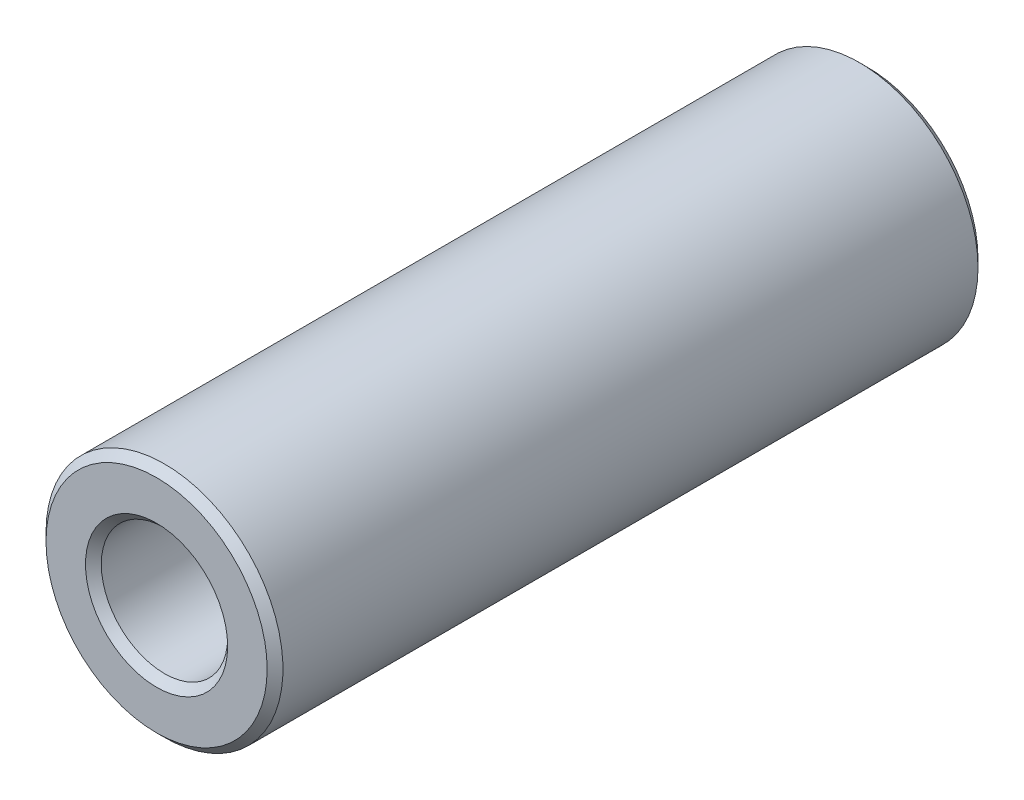
ISO-10303-21;
HEADER;
FILE_DESCRIPTION(('STEP AP214'),'2;1');
FILE_NAME('part.step','',(''),(''),'','','');
FILE_SCHEMA(('AUTOMOTIVE_DESIGN { 1 0 10303 214 1 1 1 1 }'));
ENDSEC;
DATA;
#1=APPLICATION_CONTEXT('core data for automotive mechanical design processes');
#2=APPLICATION_PROTOCOL_DEFINITION('international standard','automotive_design',2000,#1);
#3=PRODUCT_CONTEXT('',#1,'mechanical');
#4=PRODUCT('Part','Part','',(#3));
#5=PRODUCT_RELATED_PRODUCT_CATEGORY('part','',(#4));
#6=PRODUCT_DEFINITION_FORMATION('','',#4);
#7=PRODUCT_DEFINITION_CONTEXT('part definition',#1,'design');
#8=PRODUCT_DEFINITION('design','',#6,#7);
#9=PRODUCT_DEFINITION_SHAPE('','',#8);
#10=(LENGTH_UNIT() NAMED_UNIT(*) SI_UNIT(.MILLI.,.METRE.));
#11=(NAMED_UNIT(*) PLANE_ANGLE_UNIT() SI_UNIT($,.RADIAN.));
#12=(NAMED_UNIT(*) SI_UNIT($,.STERADIAN.) SOLID_ANGLE_UNIT());
#13=UNCERTAINTY_MEASURE_WITH_UNIT(LENGTH_MEASURE(1.E-05),#10,'distance_accuracy_value','');
#14=(GEOMETRIC_REPRESENTATION_CONTEXT(3) GLOBAL_UNCERTAINTY_ASSIGNED_CONTEXT((#13)) GLOBAL_UNIT_ASSIGNED_CONTEXT((#10,
#11,#12)) REPRESENTATION_CONTEXT('',''));
#15=CARTESIAN_POINT('',(0.,0.,0.));
#16=DIRECTION('',(0.,0.,1.));
#17=DIRECTION('',(1.,0.,0.));
#18=AXIS2_PLACEMENT_3D('',#15,#16,#17);
#19=CARTESIAN_POINT('',(0.,0.,45.));
#20=DIRECTION('',(0.,0.,1.));
#21=DIRECTION('',(1.,0.,0.));
#22=AXIS2_PLACEMENT_3D('',#19,#20,#21);
#23=PLANE('',#22);
#24=CARTESIAN_POINT('',(0.,0.,45.));
#25=DIRECTION('',(0.,0.,1.));
#26=DIRECTION('',(1.,0.,0.));
#27=AXIS2_PLACEMENT_3D('',#24,#25,#26);
#28=CIRCLE('',#27,4.50000000000002);
#29=CARTESIAN_POINT('',(4.50000000000002,0.,45.));
#30=VERTEX_POINT('',#29);
#31=EDGE_CURVE('E10',#30,#30,#28,.F.);
#32=ORIENTED_EDGE('',*,*,#31,.T.);
#33=EDGE_LOOP('',(#32));
#34=FACE_BOUND('',#33,.T.);
#35=CARTESIAN_POINT('',(0.,0.,45.));
#36=DIRECTION('',(0.,0.,1.));
#37=DIRECTION('',(1.,0.,0.));
#38=AXIS2_PLACEMENT_3D('',#35,#36,#37);
#39=CIRCLE('',#38,7.00000000000002);
#40=CARTESIAN_POINT('',(7.00000000000002,0.,45.));
#41=VERTEX_POINT('',#40);
#42=EDGE_CURVE('E38',#41,#41,#39,.T.);
#43=ORIENTED_EDGE('',*,*,#42,.T.);
#44=EDGE_LOOP('',(#43));
#45=FACE_BOUND('',#44,.T.);
#46=ADVANCED_FACE('F31',(#34,#45),#23,.T.);
#47=CARTESIAN_POINT('',(0.,0.,0.));
#48=DIRECTION('',(0.,0.,1.));
#49=DIRECTION('',(1.,0.,0.));
#50=AXIS2_PLACEMENT_3D('',#47,#48,#49);
#51=PLANE('',#50);
#52=CARTESIAN_POINT('',(0.,0.,0.));
#53=DIRECTION('',(0.,0.,1.));
#54=DIRECTION('',(1.,0.,0.));
#55=AXIS2_PLACEMENT_3D('',#52,#53,#54);
#56=CIRCLE('',#55,4.49999999999999);
#57=CARTESIAN_POINT('',(4.49999999999999,0.,0.));
#58=VERTEX_POINT('',#57);
#59=EDGE_CURVE('E57',#58,#58,#56,.T.);
#60=ORIENTED_EDGE('',*,*,#59,.T.);
#61=EDGE_LOOP('',(#60));
#62=FACE_BOUND('',#61,.T.);
#63=CARTESIAN_POINT('',(0.,0.,0.));
#64=DIRECTION('',(0.,0.,1.));
#65=DIRECTION('',(1.,0.,0.));
#66=AXIS2_PLACEMENT_3D('',#63,#64,#65);
#67=CIRCLE('',#66,6.99999999999997);
#68=CARTESIAN_POINT('',(6.99999999999997,0.,0.));
#69=VERTEX_POINT('',#68);
#70=EDGE_CURVE('E60',#69,#69,#67,.F.);
#71=ORIENTED_EDGE('',*,*,#70,.T.);
#72=EDGE_LOOP('',(#71));
#73=FACE_BOUND('',#72,.T.);
#74=ADVANCED_FACE('F64',(#62,#73),#51,.F.);
#75=CARTESIAN_POINT('',(0.,0.,45.));
#76=DIRECTION('',(0.,0.,-1.));
#77=DIRECTION('',(-1.,0.,0.));
#78=AXIS2_PLACEMENT_3D('',#75,#76,#77);
#79=CYLINDRICAL_SURFACE('',#78,7.5);
#80=CARTESIAN_POINT('',(0.,0.,0.500000000000028));
#81=DIRECTION('',(0.,0.,1.));
#82=DIRECTION('',(1.,0.,0.));
#83=AXIS2_PLACEMENT_3D('',#80,#81,#82);
#84=CIRCLE('',#83,7.5);
#85=CARTESIAN_POINT('',(-7.5,0.,0.500000000000021));
#86=VERTEX_POINT('',#85);
#87=EDGE_CURVE('E42',#86,#86,#84,.T.);
#88=CARTESIAN_POINT('',(0.,0.,44.5));
#89=DIRECTION('',(0.,0.,1.));
#90=DIRECTION('',(1.,0.,0.));
#91=AXIS2_PLACEMENT_3D('',#88,#89,#90);
#92=CIRCLE('',#91,7.5);
#93=CARTESIAN_POINT('',(-7.5,0.,44.5));
#94=VERTEX_POINT('',#93);
#95=EDGE_CURVE('E46',#94,#94,#92,.F.);
#96=CARTESIAN_POINT('',(-7.5,0.,0.500000000000021));
#97=CARTESIAN_POINT('',(-7.5,0.,0.958333333333355));
#98=CARTESIAN_POINT('',(-7.5,0.,1.41666666666669));
#99=CARTESIAN_POINT('',(-7.5,0.,2.33333333333336));
#100=CARTESIAN_POINT('',(-7.5,0.,2.79166666666669));
#101=CARTESIAN_POINT('',(-7.5,0.,3.70833333333336));
#102=CARTESIAN_POINT('',(-7.5,0.,4.16666666666669));
#103=CARTESIAN_POINT('',(-7.5,0.,5.08333333333336));
#104=CARTESIAN_POINT('',(-7.5,0.,5.54166666666669));
#105=CARTESIAN_POINT('',(-7.5,0.,6.45833333333335));
#106=CARTESIAN_POINT('',(-7.5,0.,6.91666666666669));
#107=CARTESIAN_POINT('',(-7.5,0.,7.83333333333335));
#108=CARTESIAN_POINT('',(-7.5,0.,8.29166666666669));
#109=CARTESIAN_POINT('',(-7.5,0.,9.20833333333336));
#110=CARTESIAN_POINT('',(-7.5,0.,9.66666666666669));
#111=CARTESIAN_POINT('',(-7.5,0.,10.5833333333334));
#112=CARTESIAN_POINT('',(-7.5,0.,11.0416666666667));
#113=CARTESIAN_POINT('',(-7.5,0.,11.9583333333334));
#114=CARTESIAN_POINT('',(-7.5,0.,12.4166666666667));
#115=CARTESIAN_POINT('',(-7.5,0.,13.3333333333334));
#116=CARTESIAN_POINT('',(-7.5,0.,13.7916666666667));
#117=CARTESIAN_POINT('',(-7.5,0.,14.7083333333334));
#118=CARTESIAN_POINT('',(-7.5,0.,15.1666666666667));
#119=CARTESIAN_POINT('',(-7.5,0.,16.0833333333334));
#120=CARTESIAN_POINT('',(-7.5,0.,16.5416666666667));
#121=CARTESIAN_POINT('',(-7.5,0.,17.4583333333334));
#122=CARTESIAN_POINT('',(-7.5,0.,17.9166666666667));
#123=CARTESIAN_POINT('',(-7.5,0.,18.8333333333334));
#124=CARTESIAN_POINT('',(-7.5,0.,19.2916666666667));
#125=CARTESIAN_POINT('',(-7.5,0.,20.2083333333334));
#126=CARTESIAN_POINT('',(-7.5,0.,20.6666666666667));
#127=CARTESIAN_POINT('',(-7.5,0.,21.5833333333334));
#128=CARTESIAN_POINT('',(-7.5,0.,22.0416666666667));
#129=CARTESIAN_POINT('',(-7.5,0.,22.9583333333334));
#130=CARTESIAN_POINT('',(-7.5,0.,23.4166666666667));
#131=CARTESIAN_POINT('',(-7.5,0.,24.3333333333334));
#132=CARTESIAN_POINT('',(-7.5,0.,24.7916666666667));
#133=CARTESIAN_POINT('',(-7.5,0.,25.7083333333334));
#134=CARTESIAN_POINT('',(-7.5,0.,26.1666666666667));
#135=CARTESIAN_POINT('',(-7.5,0.,27.0833333333334));
#136=CARTESIAN_POINT('',(-7.5,0.,27.5416666666667));
#137=CARTESIAN_POINT('',(-7.5,0.,28.4583333333334));
#138=CARTESIAN_POINT('',(-7.5,0.,28.9166666666667));
#139=CARTESIAN_POINT('',(-7.5,0.,29.8333333333334));
#140=CARTESIAN_POINT('',(-7.5,0.,30.2916666666667));
#141=CARTESIAN_POINT('',(-7.5,0.,31.2083333333334));
#142=CARTESIAN_POINT('',(-7.5,0.,31.6666666666667));
#143=CARTESIAN_POINT('',(-7.5,0.,32.5833333333333));
#144=CARTESIAN_POINT('',(-7.5,0.,33.0416666666667));
#145=CARTESIAN_POINT('',(-7.5,0.,33.9583333333333));
#146=CARTESIAN_POINT('',(-7.5,0.,34.4166666666667));
#147=CARTESIAN_POINT('',(-7.5,0.,35.3333333333333));
#148=CARTESIAN_POINT('',(-7.5,0.,35.7916666666667));
#149=CARTESIAN_POINT('',(-7.5,0.,36.7083333333333));
#150=CARTESIAN_POINT('',(-7.5,0.,37.1666666666667));
#151=CARTESIAN_POINT('',(-7.5,0.,38.0833333333333));
#152=CARTESIAN_POINT('',(-7.5,0.,38.5416666666667));
#153=CARTESIAN_POINT('',(-7.5,0.,39.4583333333333));
#154=CARTESIAN_POINT('',(-7.5,0.,39.9166666666667));
#155=CARTESIAN_POINT('',(-7.5,0.,40.8333333333333));
#156=CARTESIAN_POINT('',(-7.5,0.,41.2916666666667));
#157=CARTESIAN_POINT('',(-7.5,0.,42.2083333333333));
#158=CARTESIAN_POINT('',(-7.5,0.,42.6666666666667));
#159=CARTESIAN_POINT('',(-7.5,0.,43.5833333333333));
#160=CARTESIAN_POINT('',(-7.5,0.,44.0416666666667));
#161=CARTESIAN_POINT('',(-7.5,0.,44.5));
#162=B_SPLINE_CURVE_WITH_KNOTS('',3,(#96,#97,#98,#99,#100,#101,#102,#103,#104,#105,#106,#107,
#108,#109,#110,#111,#112,#113,#114,#115,#116,#117,#118,#119,#120,#121,#122,#123,#124,#125,#126,
#127,#128,#129,#130,#131,#132,#133,#134,#135,#136,#137,#138,#139,#140,#141,#142,#143,#144,#145,
#146,#147,#148,#149,#150,#151,#152,#153,#154,#155,#156,#157,#158,#159,#160,#161),.UNSPECIFIED.,
.F.,.F.,(4,2,2,2,2,2,2,2,2,2,2,2,2,2,2,2,2,2,2,2,2,2,2,2,2,2,2,2,2,2,2,2,4),(0.,1.375,2.75,
4.125,5.5,6.875,8.25,9.625,11.,12.375,13.75,15.125,16.5,17.875,19.25,20.625,22.,23.375,24.75,
26.125,27.5,28.875,30.25,31.625,33.,34.375,35.75,37.125,38.5,39.875,41.25,42.625,44.),.UNSPECIFIED.);
#163=EDGE_CURVE('BSEAM74',#86,#94,#162,.T.);
#164=ORIENTED_EDGE('',*,*,#87,.T.);
#165=ORIENTED_EDGE('',*,*,#95,.T.);
#166=ORIENTED_EDGE('',*,*,#163,.T.);
#167=ORIENTED_EDGE('',*,*,#163,.F.);
#168=EDGE_LOOP('',(#164,#166,#165,#167));
#169=FACE_BOUND('',#168,.T.);
#170=ADVANCED_FACE('F74',(#169),#79,.T.);
#171=CARTESIAN_POINT('',(0.,0.,45.));
#172=DIRECTION('',(0.,0.,-1.));
#173=DIRECTION('',(-1.,0.,0.));
#174=AXIS2_PLACEMENT_3D('',#171,#172,#173);
#175=CYLINDRICAL_SURFACE('',#174,4.);
#176=CARTESIAN_POINT('',(0.,0.,0.499999999999994));
#177=DIRECTION('',(0.,0.,1.));
#178=DIRECTION('',(1.,0.,0.));
#179=AXIS2_PLACEMENT_3D('',#176,#177,#178);
#180=CIRCLE('',#179,4.);
#181=CARTESIAN_POINT('',(-4.,0.,0.499999999999994));
#182=VERTEX_POINT('',#181);
#183=EDGE_CURVE('E51',#182,#182,#180,.F.);
#184=CARTESIAN_POINT('',(0.,0.,44.5));
#185=DIRECTION('',(0.,0.,1.));
#186=DIRECTION('',(1.,0.,0.));
#187=AXIS2_PLACEMENT_3D('',#184,#185,#186);
#188=CIRCLE('',#187,4.);
#189=CARTESIAN_POINT('',(-4.,0.,44.5));
#190=VERTEX_POINT('',#189);
#191=EDGE_CURVE('E54',#190,#190,#188,.T.);
#192=CARTESIAN_POINT('',(-4.,0.,0.499999999999994));
#193=CARTESIAN_POINT('',(-4.,0.,0.958333333333328));
#194=CARTESIAN_POINT('',(-4.,0.,1.41666666666666));
#195=CARTESIAN_POINT('',(-4.,0.,2.33333333333333));
#196=CARTESIAN_POINT('',(-4.,0.,2.79166666666666));
#197=CARTESIAN_POINT('',(-4.,0.,3.70833333333333));
#198=CARTESIAN_POINT('',(-4.,0.,4.16666666666666));
#199=CARTESIAN_POINT('',(-4.,0.,5.08333333333332));
#200=CARTESIAN_POINT('',(-4.,0.,5.54166666666666));
#201=CARTESIAN_POINT('',(-4.,0.,6.45833333333333));
#202=CARTESIAN_POINT('',(-4.,0.,6.91666666666666));
#203=CARTESIAN_POINT('',(-4.,0.,7.83333333333332));
#204=CARTESIAN_POINT('',(-4.,0.,8.29166666666666));
#205=CARTESIAN_POINT('',(-4.,0.,9.20833333333332));
#206=CARTESIAN_POINT('',(-4.,0.,9.66666666666666));
#207=CARTESIAN_POINT('',(-4.,0.,10.5833333333333));
#208=CARTESIAN_POINT('',(-4.,0.,11.0416666666667));
#209=CARTESIAN_POINT('',(-4.,0.,11.9583333333333));
#210=CARTESIAN_POINT('',(-4.,0.,12.4166666666667));
#211=CARTESIAN_POINT('',(-4.,0.,13.3333333333333));
#212=CARTESIAN_POINT('',(-4.,0.,13.7916666666667));
#213=CARTESIAN_POINT('',(-4.,0.,14.7083333333333));
#214=CARTESIAN_POINT('',(-4.,0.,15.1666666666667));
#215=CARTESIAN_POINT('',(-4.,0.,16.0833333333333));
#216=CARTESIAN_POINT('',(-4.,0.,16.5416666666667));
#217=CARTESIAN_POINT('',(-4.,0.,17.4583333333333));
#218=CARTESIAN_POINT('',(-4.,0.,17.9166666666667));
#219=CARTESIAN_POINT('',(-4.,0.,18.8333333333333));
#220=CARTESIAN_POINT('',(-4.,0.,19.2916666666667));
#221=CARTESIAN_POINT('',(-4.,0.,20.2083333333333));
#222=CARTESIAN_POINT('',(-4.,0.,20.6666666666667));
#223=CARTESIAN_POINT('',(-4.,0.,21.5833333333333));
#224=CARTESIAN_POINT('',(-4.,0.,22.0416666666666));
#225=CARTESIAN_POINT('',(-4.,0.,22.9583333333333));
#226=CARTESIAN_POINT('',(-4.,0.,23.4166666666666));
#227=CARTESIAN_POINT('',(-4.,0.,24.3333333333333));
#228=CARTESIAN_POINT('',(-4.,0.,24.7916666666667));
#229=CARTESIAN_POINT('',(-4.,0.,25.7083333333333));
#230=CARTESIAN_POINT('',(-4.,0.,26.1666666666666));
#231=CARTESIAN_POINT('',(-4.,0.,27.0833333333333));
#232=CARTESIAN_POINT('',(-4.,0.,27.5416666666666));
#233=CARTESIAN_POINT('',(-4.,0.,28.4583333333333));
#234=CARTESIAN_POINT('',(-4.,0.,28.9166666666666));
#235=CARTESIAN_POINT('',(-4.,0.,29.8333333333333));
#236=CARTESIAN_POINT('',(-4.,0.,30.2916666666666));
#237=CARTESIAN_POINT('',(-4.,0.,31.2083333333333));
#238=CARTESIAN_POINT('',(-4.,0.,31.6666666666666));
#239=CARTESIAN_POINT('',(-4.,0.,32.5833333333333));
#240=CARTESIAN_POINT('',(-4.,0.,33.0416666666666));
#241=CARTESIAN_POINT('',(-4.,0.,33.9583333333333));
#242=CARTESIAN_POINT('',(-4.,0.,34.4166666666666));
#243=CARTESIAN_POINT('',(-4.,0.,35.3333333333333));
#244=CARTESIAN_POINT('',(-4.,0.,35.7916666666666));
#245=CARTESIAN_POINT('',(-4.,0.,36.7083333333333));
#246=CARTESIAN_POINT('',(-4.,0.,37.1666666666666));
#247=CARTESIAN_POINT('',(-4.,0.,38.0833333333333));
#248=CARTESIAN_POINT('',(-4.,0.,38.5416666666666));
#249=CARTESIAN_POINT('',(-4.,0.,39.4583333333333));
#250=CARTESIAN_POINT('',(-4.,0.,39.9166666666666));
#251=CARTESIAN_POINT('',(-4.,0.,40.8333333333333));
#252=CARTESIAN_POINT('',(-4.,0.,41.2916666666666));
#253=CARTESIAN_POINT('',(-4.,0.,42.2083333333333));
#254=CARTESIAN_POINT('',(-4.,0.,42.6666666666666));
#255=CARTESIAN_POINT('',(-4.,0.,43.5833333333333));
#256=CARTESIAN_POINT('',(-4.,0.,44.0416666666666));
#257=CARTESIAN_POINT('',(-4.,0.,44.5));
#258=B_SPLINE_CURVE_WITH_KNOTS('',3,(#192,#193,#194,#195,#196,#197,#198,#199,#200,#201,#202,
#203,#204,#205,#206,#207,#208,#209,#210,#211,#212,#213,#214,#215,#216,#217,#218,#219,#220,#221,
#222,#223,#224,#225,#226,#227,#228,#229,#230,#231,#232,#233,#234,#235,#236,#237,#238,#239,#240,
#241,#242,#243,#244,#245,#246,#247,#248,#249,#250,#251,#252,#253,#254,#255,#256,#257),
.UNSPECIFIED.,.F.,.F.,(4,2,2,2,2,2,2,2,2,2,2,2,2,2,2,2,2,2,2,2,2,2,2,2,2,2,2,2,2,2,2,2,4),(0.,
1.375,2.75,4.125,5.5,6.875,8.24999999999999,9.62499999999999,11.,12.375,13.75,15.125,16.5,
17.875,19.25,20.625,22.,23.375,24.75,26.125,27.5,28.875,30.25,31.625,33.,34.375,35.75,37.125,
38.5,39.875,41.25,42.625,44.),.UNSPECIFIED.);
#259=EDGE_CURVE('BSEAM77',#182,#190,#258,.T.);
#260=ORIENTED_EDGE('',*,*,#183,.T.);
#261=ORIENTED_EDGE('',*,*,#191,.T.);
#262=ORIENTED_EDGE('',*,*,#259,.T.);
#263=ORIENTED_EDGE('',*,*,#259,.F.);
#264=EDGE_LOOP('',(#260,#262,#261,#263));
#265=FACE_BOUND('',#264,.T.);
#266=ADVANCED_FACE('F77',(#265),#175,.F.);
#267=CARTESIAN_POINT('',(0.,0.,0.));
#268=DIRECTION('',(0.,0.,-1.));
#269=DIRECTION('',(-1.,0.,0.));
#270=AXIS2_PLACEMENT_3D('',#267,#268,#269);
#271=CONICAL_SURFACE('',#270,4.49999999999999,0.785398163397444);
#272=ORIENTED_EDGE('',*,*,#183,.F.);
#273=EDGE_LOOP('',(#272));
#274=FACE_BOUND('',#273,.T.);
#275=ORIENTED_EDGE('',*,*,#59,.F.);
#276=EDGE_LOOP('',(#275));
#277=FACE_BOUND('',#276,.T.);
#278=ADVANCED_FACE('F70',(#274,#277),#271,.F.);
#279=CARTESIAN_POINT('',(0.,0.,0.500000000000028));
#280=DIRECTION('',(0.,0.,1.));
#281=DIRECTION('',(1.,0.,0.));
#282=AXIS2_PLACEMENT_3D('',#279,#280,#281);
#283=CONICAL_SURFACE('',#282,7.5,0.785398163397449);
#284=ORIENTED_EDGE('',*,*,#70,.F.);
#285=EDGE_LOOP('',(#284));
#286=FACE_BOUND('',#285,.T.);
#287=ORIENTED_EDGE('',*,*,#87,.F.);
#288=EDGE_LOOP('',(#287));
#289=FACE_BOUND('',#288,.T.);
#290=ADVANCED_FACE('F66',(#286,#289),#283,.T.);
#291=CARTESIAN_POINT('',(0.,0.,44.5));
#292=DIRECTION('',(0.,0.,1.));
#293=DIRECTION('',(1.,0.,0.));
#294=AXIS2_PLACEMENT_3D('',#291,#292,#293);
#295=CONICAL_SURFACE('',#294,4.,0.785398163397451);
#296=ORIENTED_EDGE('',*,*,#31,.F.);
#297=EDGE_LOOP('',(#296));
#298=FACE_BOUND('',#297,.T.);
#299=ORIENTED_EDGE('',*,*,#191,.F.);
#300=EDGE_LOOP('',(#299));
#301=FACE_BOUND('',#300,.T.);
#302=ADVANCED_FACE('F69',(#298,#301),#295,.F.);
#303=CARTESIAN_POINT('',(0.,0.,45.));
#304=DIRECTION('',(0.,0.,-1.));
#305=DIRECTION('',(-1.,0.,0.));
#306=AXIS2_PLACEMENT_3D('',#303,#304,#305);
#307=CONICAL_SURFACE('',#306,7.00000000000002,0.78539816339745);
#308=ORIENTED_EDGE('',*,*,#95,.F.);
#309=EDGE_LOOP('',(#308));
#310=FACE_BOUND('',#309,.T.);
#311=ORIENTED_EDGE('',*,*,#42,.F.);
#312=EDGE_LOOP('',(#311));
#313=FACE_BOUND('',#312,.T.);
#314=ADVANCED_FACE('F33',(#310,#313),#307,.T.);
#315=CLOSED_SHELL('',(#46,#74,#170,#266,#278,#290,#302,#314));
#316=MANIFOLD_SOLID_BREP('B2',#315);
#317=ADVANCED_BREP_SHAPE_REPRESENTATION('',(#18,#316),#14);
#318=SHAPE_DEFINITION_REPRESENTATION(#9,#317);
ENDSEC;
END-ISO-10303-21;
